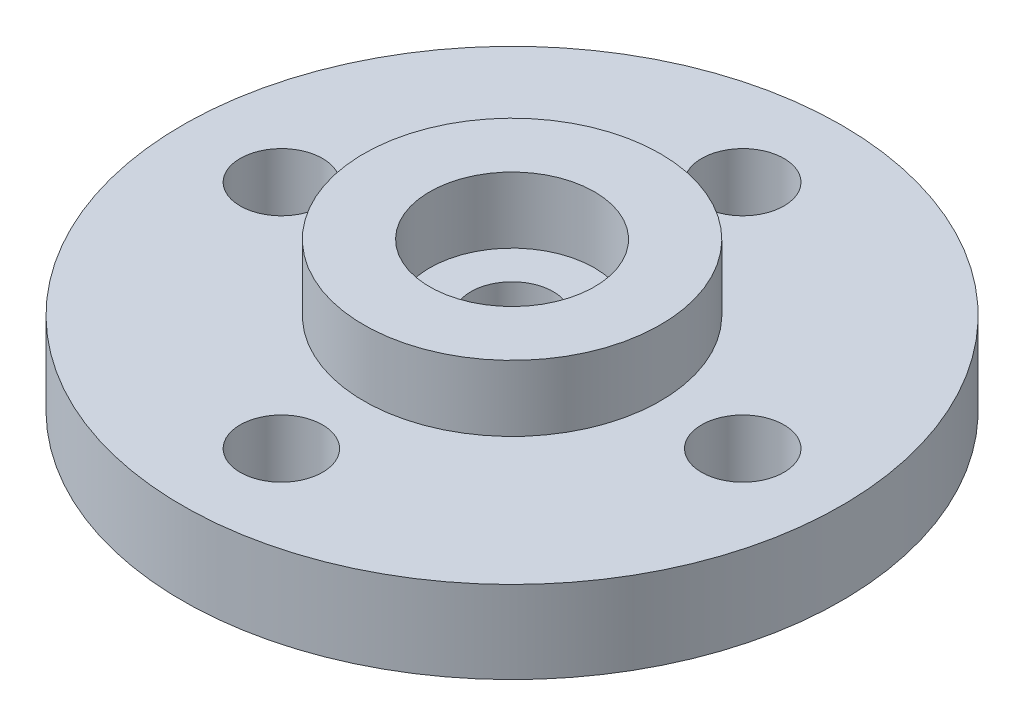
ISO-10303-21;
HEADER;
FILE_DESCRIPTION(('STEP AP214'),'2;1');
FILE_NAME('part.step','',(''),(''),'','','');
FILE_SCHEMA(('AUTOMOTIVE_DESIGN { 1 0 10303 214 1 1 1 1 }'));
ENDSEC;
DATA;
#1=APPLICATION_CONTEXT('core data for automotive mechanical design processes');
#2=APPLICATION_PROTOCOL_DEFINITION('international standard','automotive_design',2000,#1);
#3=PRODUCT_CONTEXT('',#1,'mechanical');
#4=PRODUCT('Part','Part','',(#3));
#5=PRODUCT_RELATED_PRODUCT_CATEGORY('part','',(#4));
#6=PRODUCT_DEFINITION_FORMATION('','',#4);
#7=PRODUCT_DEFINITION_CONTEXT('part definition',#1,'design');
#8=PRODUCT_DEFINITION('design','',#6,#7);
#9=PRODUCT_DEFINITION_SHAPE('','',#8);
#10=(LENGTH_UNIT() NAMED_UNIT(*) SI_UNIT(.MILLI.,.METRE.));
#11=(NAMED_UNIT(*) PLANE_ANGLE_UNIT() SI_UNIT($,.RADIAN.));
#12=(NAMED_UNIT(*) SI_UNIT($,.STERADIAN.) SOLID_ANGLE_UNIT());
#13=UNCERTAINTY_MEASURE_WITH_UNIT(LENGTH_MEASURE(1.E-05),#10,'distance_accuracy_value','');
#14=(GEOMETRIC_REPRESENTATION_CONTEXT(3) GLOBAL_UNCERTAINTY_ASSIGNED_CONTEXT((#13)) GLOBAL_UNIT_ASSIGNED_CONTEXT((#10,
#11,#12)) REPRESENTATION_CONTEXT('',''));
#15=CARTESIAN_POINT('',(0.,0.,0.));
#16=DIRECTION('',(0.,0.,1.));
#17=DIRECTION('',(1.,0.,0.));
#18=AXIS2_PLACEMENT_3D('',#15,#16,#17);
#19=CARTESIAN_POINT('',(10.,0.,0.));
#20=DIRECTION('',(0.,-1.,0.));
#21=DIRECTION('',(0.,0.,-1.));
#22=AXIS2_PLACEMENT_3D('',#19,#20,#21);
#23=PLANE('',#22);
#24=CARTESIAN_POINT('',(0.,0.,-7.));
#25=DIRECTION('',(0.,1.,0.));
#26=DIRECTION('',(0.,0.,1.));
#27=AXIS2_PLACEMENT_3D('',#24,#25,#26);
#28=CIRCLE('',#27,1.25);
#29=CARTESIAN_POINT('',(0.,0.,-5.75));
#30=VERTEX_POINT('',#29);
#31=EDGE_CURVE('E90',#30,#30,#28,.T.);
#32=ORIENTED_EDGE('',*,*,#31,.T.);
#33=EDGE_LOOP('',(#32));
#34=FACE_BOUND('',#33,.T.);
#35=CARTESIAN_POINT('',(0.,0.,7.));
#36=DIRECTION('',(0.,1.,0.));
#37=DIRECTION('',(0.,0.,1.));
#38=AXIS2_PLACEMENT_3D('',#35,#36,#37);
#39=CIRCLE('',#38,1.25);
#40=CARTESIAN_POINT('',(0.,0.,8.25));
#41=VERTEX_POINT('',#40);
#42=EDGE_CURVE('E83',#41,#41,#39,.T.);
#43=ORIENTED_EDGE('',*,*,#42,.T.);
#44=EDGE_LOOP('',(#43));
#45=FACE_BOUND('',#44,.T.);
#46=CARTESIAN_POINT('',(0.,0.,0.));
#47=DIRECTION('',(0.,-1.,0.));
#48=DIRECTION('',(0.,0.,-1.));
#49=AXIS2_PLACEMENT_3D('',#46,#47,#48);
#50=CIRCLE('',#49,10.);
#51=CARTESIAN_POINT('',(0.,0.,-10.));
#52=VERTEX_POINT('',#51);
#53=EDGE_CURVE('E58',#52,#52,#50,.T.);
#54=ORIENTED_EDGE('',*,*,#53,.T.);
#55=EDGE_LOOP('',(#54));
#56=FACE_BOUND('',#55,.T.);
#57=CARTESIAN_POINT('',(0.,0.,0.));
#58=DIRECTION('',(0.,1.,0.));
#59=DIRECTION('',(0.,0.,1.));
#60=AXIS2_PLACEMENT_3D('',#57,#58,#59);
#61=CIRCLE('',#60,1.25);
#62=CARTESIAN_POINT('',(0.,0.,1.25));
#63=VERTEX_POINT('',#62);
#64=EDGE_CURVE('E61',#63,#63,#61,.T.);
#65=ORIENTED_EDGE('',*,*,#64,.T.);
#66=EDGE_LOOP('',(#65));
#67=FACE_BOUND('',#66,.T.);
#68=CARTESIAN_POINT('',(7.,0.,0.));
#69=DIRECTION('',(0.,1.,0.));
#70=DIRECTION('',(0.,0.,1.));
#71=AXIS2_PLACEMENT_3D('',#68,#69,#70);
#72=CIRCLE('',#71,1.25);
#73=CARTESIAN_POINT('',(7.,0.,1.25));
#74=VERTEX_POINT('',#73);
#75=EDGE_CURVE('E69',#74,#74,#72,.T.);
#76=ORIENTED_EDGE('',*,*,#75,.T.);
#77=EDGE_LOOP('',(#76));
#78=FACE_BOUND('',#77,.T.);
#79=CARTESIAN_POINT('',(-7.,0.,0.));
#80=DIRECTION('',(0.,1.,0.));
#81=DIRECTION('',(0.,0.,1.));
#82=AXIS2_PLACEMENT_3D('',#79,#80,#81);
#83=CIRCLE('',#82,1.25);
#84=CARTESIAN_POINT('',(-7.,0.,1.25));
#85=VERTEX_POINT('',#84);
#86=EDGE_CURVE('E74',#85,#85,#83,.T.);
#87=ORIENTED_EDGE('',*,*,#86,.T.);
#88=EDGE_LOOP('',(#87));
#89=FACE_BOUND('',#88,.T.);
#90=ADVANCED_FACE('F40',(#34,#45,#56,#67,#78,#89),#23,.T.);
#91=CARTESIAN_POINT('',(0.,2.5,0.));
#92=DIRECTION('',(0.,1.,0.));
#93=DIRECTION('',(0.,0.,1.));
#94=AXIS2_PLACEMENT_3D('',#91,#92,#93);
#95=PLANE('',#94);
#96=CARTESIAN_POINT('',(0.,2.5,0.));
#97=DIRECTION('',(0.,1.,0.));
#98=DIRECTION('',(0.,0.,1.));
#99=AXIS2_PLACEMENT_3D('',#96,#97,#98);
#100=CIRCLE('',#99,1.25);
#101=CARTESIAN_POINT('',(0.,2.5,1.25));
#102=VERTEX_POINT('',#101);
#103=EDGE_CURVE('E67',#102,#102,#100,.T.);
#104=ORIENTED_EDGE('',*,*,#103,.F.);
#105=EDGE_LOOP('',(#104));
#106=FACE_BOUND('',#105,.T.);
#107=CARTESIAN_POINT('',(0.,2.5,0.));
#108=DIRECTION('',(0.,-1.,0.));
#109=DIRECTION('',(0.,0.,-1.));
#110=AXIS2_PLACEMENT_3D('',#107,#108,#109);
#111=CIRCLE('',#110,2.5);
#112=CARTESIAN_POINT('',(0.,2.5,-2.5));
#113=VERTEX_POINT('',#112);
#114=EDGE_CURVE('E10',#113,#113,#111,.T.);
#115=ORIENTED_EDGE('',*,*,#114,.F.);
#116=EDGE_LOOP('',(#115));
#117=FACE_BOUND('',#116,.T.);
#118=ADVANCED_FACE('F39',(#106,#117),#95,.T.);
#119=CARTESIAN_POINT('',(0.,0.,0.));
#120=DIRECTION('',(0.,-1.,0.));
#121=DIRECTION('',(0.,0.,-1.));
#122=AXIS2_PLACEMENT_3D('',#119,#120,#121);
#123=CYLINDRICAL_SURFACE('',#122,2.5);
#124=ORIENTED_EDGE('',*,*,#114,.T.);
#125=EDGE_LOOP('',(#124));
#126=FACE_BOUND('',#125,.T.);
#127=CARTESIAN_POINT('',(0.,4.5,0.));
#128=DIRECTION('',(0.,-1.,0.));
#129=DIRECTION('',(0.,0.,-1.));
#130=AXIS2_PLACEMENT_3D('',#127,#128,#129);
#131=CIRCLE('',#130,2.5);
#132=CARTESIAN_POINT('',(0.,4.5,-2.5));
#133=VERTEX_POINT('',#132);
#134=EDGE_CURVE('E42',#133,#133,#131,.T.);
#135=ORIENTED_EDGE('',*,*,#134,.F.);
#136=EDGE_LOOP('',(#135));
#137=FACE_BOUND('',#136,.T.);
#138=ADVANCED_FACE('F155',(#126,#137),#123,.F.);
#139=CARTESIAN_POINT('',(2.5,4.5,0.));
#140=DIRECTION('',(0.,1.,0.));
#141=DIRECTION('',(0.,0.,1.));
#142=AXIS2_PLACEMENT_3D('',#139,#140,#141);
#143=PLANE('',#142);
#144=ORIENTED_EDGE('',*,*,#134,.T.);
#145=EDGE_LOOP('',(#144));
#146=FACE_BOUND('',#145,.T.);
#147=CARTESIAN_POINT('',(0.,4.5,0.));
#148=DIRECTION('',(0.,-1.,0.));
#149=DIRECTION('',(0.,0.,-1.));
#150=AXIS2_PLACEMENT_3D('',#147,#148,#149);
#151=CIRCLE('',#150,4.5);
#152=CARTESIAN_POINT('',(0.,4.5,-4.5));
#153=VERTEX_POINT('',#152);
#154=EDGE_CURVE('E48',#153,#153,#151,.T.);
#155=ORIENTED_EDGE('',*,*,#154,.F.);
#156=EDGE_LOOP('',(#155));
#157=FACE_BOUND('',#156,.T.);
#158=ADVANCED_FACE('F146',(#146,#157),#143,.T.);
#159=CARTESIAN_POINT('',(0.,0.,0.));
#160=DIRECTION('',(0.,-1.,0.));
#161=DIRECTION('',(0.,0.,-1.));
#162=AXIS2_PLACEMENT_3D('',#159,#160,#161);
#163=CYLINDRICAL_SURFACE('',#162,4.5);
#164=ORIENTED_EDGE('',*,*,#154,.T.);
#165=EDGE_LOOP('',(#164));
#166=FACE_BOUND('',#165,.T.);
#167=CARTESIAN_POINT('',(0.,2.5,0.));
#168=DIRECTION('',(0.,-1.,0.));
#169=DIRECTION('',(0.,0.,-1.));
#170=AXIS2_PLACEMENT_3D('',#167,#168,#169);
#171=CIRCLE('',#170,4.5);
#172=CARTESIAN_POINT('',(0.,2.5,-4.5));
#173=VERTEX_POINT('',#172);
#174=EDGE_CURVE('E55',#173,#173,#171,.T.);
#175=ORIENTED_EDGE('',*,*,#174,.F.);
#176=EDGE_LOOP('',(#175));
#177=FACE_BOUND('',#176,.T.);
#178=ADVANCED_FACE('F99',(#166,#177),#163,.T.);
#179=CARTESIAN_POINT('',(4.5,2.5,0.));
#180=DIRECTION('',(0.,1.,0.));
#181=DIRECTION('',(0.,0.,1.));
#182=AXIS2_PLACEMENT_3D('',#179,#180,#181);
#183=PLANE('',#182);
#184=CARTESIAN_POINT('',(0.,2.5,-7.));
#185=DIRECTION('',(0.,1.,0.));
#186=DIRECTION('',(0.,0.,1.));
#187=AXIS2_PLACEMENT_3D('',#184,#185,#186);
#188=CIRCLE('',#187,1.25);
#189=CARTESIAN_POINT('',(0.,2.5,-5.75));
#190=VERTEX_POINT('',#189);
#191=EDGE_CURVE('E89',#190,#190,#188,.T.);
#192=ORIENTED_EDGE('',*,*,#191,.F.);
#193=EDGE_LOOP('',(#192));
#194=FACE_BOUND('',#193,.T.);
#195=CARTESIAN_POINT('',(0.,2.5,7.));
#196=DIRECTION('',(0.,1.,0.));
#197=DIRECTION('',(0.,0.,1.));
#198=AXIS2_PLACEMENT_3D('',#195,#196,#197);
#199=CIRCLE('',#198,1.25);
#200=CARTESIAN_POINT('',(0.,2.5,8.25));
#201=VERTEX_POINT('',#200);
#202=EDGE_CURVE('E84',#201,#201,#199,.T.);
#203=ORIENTED_EDGE('',*,*,#202,.F.);
#204=EDGE_LOOP('',(#203));
#205=FACE_BOUND('',#204,.T.);
#206=CARTESIAN_POINT('',(-7.,2.5,0.));
#207=DIRECTION('',(0.,1.,0.));
#208=DIRECTION('',(0.,0.,1.));
#209=AXIS2_PLACEMENT_3D('',#206,#207,#208);
#210=CIRCLE('',#209,1.25);
#211=CARTESIAN_POINT('',(-7.,2.5,1.25));
#212=VERTEX_POINT('',#211);
#213=EDGE_CURVE('E76',#212,#212,#210,.T.);
#214=ORIENTED_EDGE('',*,*,#213,.F.);
#215=EDGE_LOOP('',(#214));
#216=FACE_BOUND('',#215,.T.);
#217=CARTESIAN_POINT('',(7.,2.5,0.));
#218=DIRECTION('',(0.,1.,0.));
#219=DIRECTION('',(0.,0.,1.));
#220=AXIS2_PLACEMENT_3D('',#217,#218,#219);
#221=CIRCLE('',#220,1.25);
#222=CARTESIAN_POINT('',(7.,2.5,1.25));
#223=VERTEX_POINT('',#222);
#224=EDGE_CURVE('E75',#223,#223,#221,.T.);
#225=ORIENTED_EDGE('',*,*,#224,.F.);
#226=EDGE_LOOP('',(#225));
#227=FACE_BOUND('',#226,.T.);
#228=ORIENTED_EDGE('',*,*,#174,.T.);
#229=EDGE_LOOP('',(#228));
#230=FACE_BOUND('',#229,.T.);
#231=CARTESIAN_POINT('',(0.,2.5,0.));
#232=DIRECTION('',(0.,-1.,0.));
#233=DIRECTION('',(0.,0.,-1.));
#234=AXIS2_PLACEMENT_3D('',#231,#232,#233);
#235=CIRCLE('',#234,10.);
#236=CARTESIAN_POINT('',(0.,2.5,-10.));
#237=VERTEX_POINT('',#236);
#238=EDGE_CURVE('E60',#237,#237,#235,.T.);
#239=ORIENTED_EDGE('',*,*,#238,.F.);
#240=EDGE_LOOP('',(#239));
#241=FACE_BOUND('',#240,.T.);
#242=ADVANCED_FACE('F96',(#194,#205,#216,#227,#230,#241),#183,.T.);
#243=CARTESIAN_POINT('',(0.,0.,0.));
#244=DIRECTION('',(0.,-1.,0.));
#245=DIRECTION('',(0.,0.,-1.));
#246=AXIS2_PLACEMENT_3D('',#243,#244,#245);
#247=CYLINDRICAL_SURFACE('',#246,10.);
#248=ORIENTED_EDGE('',*,*,#238,.T.);
#249=EDGE_LOOP('',(#248));
#250=FACE_BOUND('',#249,.T.);
#251=ORIENTED_EDGE('',*,*,#53,.F.);
#252=EDGE_LOOP('',(#251));
#253=FACE_BOUND('',#252,.T.);
#254=ADVANCED_FACE('F98',(#250,#253),#247,.T.);
#255=CARTESIAN_POINT('',(0.,2.5,0.));
#256=DIRECTION('',(0.,1.,0.));
#257=DIRECTION('',(0.,0.,1.));
#258=AXIS2_PLACEMENT_3D('',#255,#256,#257);
#259=CYLINDRICAL_SURFACE('',#258,1.25);
#260=ORIENTED_EDGE('',*,*,#64,.F.);
#261=EDGE_LOOP('',(#260));
#262=FACE_BOUND('',#261,.T.);
#263=ORIENTED_EDGE('',*,*,#103,.T.);
#264=EDGE_LOOP('',(#263));
#265=FACE_BOUND('',#264,.T.);
#266=ADVANCED_FACE('F114',(#262,#265),#259,.F.);
#267=CARTESIAN_POINT('',(7.,2.5,0.));
#268=DIRECTION('',(0.,1.,0.));
#269=DIRECTION('',(0.,0.,1.));
#270=AXIS2_PLACEMENT_3D('',#267,#268,#269);
#271=CYLINDRICAL_SURFACE('',#270,1.25);
#272=ORIENTED_EDGE('',*,*,#75,.F.);
#273=EDGE_LOOP('',(#272));
#274=FACE_BOUND('',#273,.T.);
#275=ORIENTED_EDGE('',*,*,#224,.T.);
#276=EDGE_LOOP('',(#275));
#277=FACE_BOUND('',#276,.T.);
#278=ADVANCED_FACE('F135',(#274,#277),#271,.F.);
#279=CARTESIAN_POINT('',(-7.,2.5,0.));
#280=DIRECTION('',(0.,1.,0.));
#281=DIRECTION('',(0.,0.,1.));
#282=AXIS2_PLACEMENT_3D('',#279,#280,#281);
#283=CYLINDRICAL_SURFACE('',#282,1.25);
#284=ORIENTED_EDGE('',*,*,#86,.F.);
#285=EDGE_LOOP('',(#284));
#286=FACE_BOUND('',#285,.T.);
#287=ORIENTED_EDGE('',*,*,#213,.T.);
#288=EDGE_LOOP('',(#287));
#289=FACE_BOUND('',#288,.T.);
#290=ADVANCED_FACE('F126',(#286,#289),#283,.F.);
#291=CARTESIAN_POINT('',(0.,2.5,7.));
#292=DIRECTION('',(0.,1.,0.));
#293=DIRECTION('',(0.,0.,1.));
#294=AXIS2_PLACEMENT_3D('',#291,#292,#293);
#295=CYLINDRICAL_SURFACE('',#294,1.25);
#296=ORIENTED_EDGE('',*,*,#42,.F.);
#297=EDGE_LOOP('',(#296));
#298=FACE_BOUND('',#297,.T.);
#299=ORIENTED_EDGE('',*,*,#202,.T.);
#300=EDGE_LOOP('',(#299));
#301=FACE_BOUND('',#300,.T.);
#302=ADVANCED_FACE('F131',(#298,#301),#295,.F.);
#303=CARTESIAN_POINT('',(0.,2.5,-7.));
#304=DIRECTION('',(0.,1.,0.));
#305=DIRECTION('',(0.,0.,1.));
#306=AXIS2_PLACEMENT_3D('',#303,#304,#305);
#307=CYLINDRICAL_SURFACE('',#306,1.25);
#308=ORIENTED_EDGE('',*,*,#31,.F.);
#309=EDGE_LOOP('',(#308));
#310=FACE_BOUND('',#309,.T.);
#311=ORIENTED_EDGE('',*,*,#191,.T.);
#312=EDGE_LOOP('',(#311));
#313=FACE_BOUND('',#312,.T.);
#314=ADVANCED_FACE('F92',(#310,#313),#307,.F.);
#315=CLOSED_SHELL('',(#90,#118,#138,#158,#178,#242,#254,#266,#278,#290,#302,#314));
#316=MANIFOLD_SOLID_BREP('B2',#315);
#317=ADVANCED_BREP_SHAPE_REPRESENTATION('',(#18,#316),#14);
#318=SHAPE_DEFINITION_REPRESENTATION(#9,#317);
ENDSEC;
END-ISO-10303-21;
